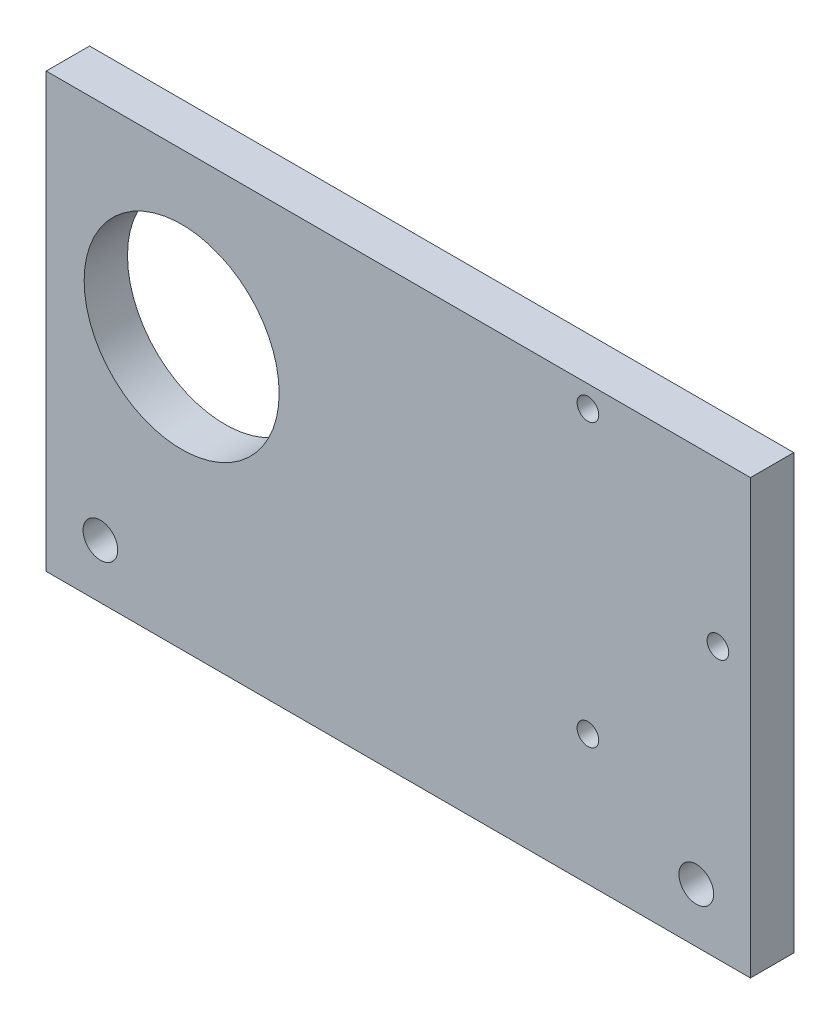
ISO-10303-21;
HEADER;
FILE_DESCRIPTION(('STEP AP214'),'2;1');
FILE_NAME('part.step','',(''),(''),'','','');
FILE_SCHEMA(('AUTOMOTIVE_DESIGN { 1 0 10303 214 1 1 1 1 }'));
ENDSEC;
DATA;
#1=APPLICATION_CONTEXT('core data for automotive mechanical design processes');
#2=APPLICATION_PROTOCOL_DEFINITION('international standard','automotive_design',2000,#1);
#3=PRODUCT_CONTEXT('',#1,'mechanical');
#4=PRODUCT('Part','Part','',(#3));
#5=PRODUCT_RELATED_PRODUCT_CATEGORY('part','',(#4));
#6=PRODUCT_DEFINITION_FORMATION('','',#4);
#7=PRODUCT_DEFINITION_CONTEXT('part definition',#1,'design');
#8=PRODUCT_DEFINITION('design','',#6,#7);
#9=PRODUCT_DEFINITION_SHAPE('','',#8);
#10=(LENGTH_UNIT() NAMED_UNIT(*) SI_UNIT(.MILLI.,.METRE.));
#11=(NAMED_UNIT(*) PLANE_ANGLE_UNIT() SI_UNIT($,.RADIAN.));
#12=(NAMED_UNIT(*) SI_UNIT($,.STERADIAN.) SOLID_ANGLE_UNIT());
#13=UNCERTAINTY_MEASURE_WITH_UNIT(LENGTH_MEASURE(1.E-05),#10,'distance_accuracy_value','');
#14=(GEOMETRIC_REPRESENTATION_CONTEXT(3) GLOBAL_UNCERTAINTY_ASSIGNED_CONTEXT((#13)) GLOBAL_UNIT_ASSIGNED_CONTEXT((#10,
#11,#12)) REPRESENTATION_CONTEXT('',''));
#15=CARTESIAN_POINT('',(0.,0.,0.));
#16=DIRECTION('',(0.,0.,1.));
#17=DIRECTION('',(1.,0.,0.));
#18=AXIS2_PLACEMENT_3D('',#15,#16,#17);
#19=CARTESIAN_POINT('',(0.,0.,4.));
#20=DIRECTION('',(0.,0.,-1.));
#21=DIRECTION('',(-1.,0.,0.));
#22=AXIS2_PLACEMENT_3D('',#19,#20,#21);
#23=PLANE('',#22);
#24=DIRECTION('',(0.,-1.,0.));
#25=VECTOR('',#24,1.);
#26=CARTESIAN_POINT('',(0.,0.,4.));
#27=LINE('',#26,#25);
#28=CARTESIAN_POINT('',(0.,40.,4.));
#29=VERTEX_POINT('',#28);
#30=CARTESIAN_POINT('',(0.,0.,4.));
#31=VERTEX_POINT('',#30);
#32=EDGE_CURVE('E85',#29,#31,#27,.T.);
#33=ORIENTED_EDGE('',*,*,#32,.T.);
#34=DIRECTION('',(1.,0.,0.));
#35=VECTOR('',#34,1.);
#36=CARTESIAN_POINT('',(0.,0.,4.));
#37=LINE('',#36,#35);
#38=CARTESIAN_POINT('',(65.,0.,4.));
#39=VERTEX_POINT('',#38);
#40=EDGE_CURVE('E80',#31,#39,#37,.T.);
#41=ORIENTED_EDGE('',*,*,#40,.T.);
#42=DIRECTION('',(0.,1.,0.));
#43=VECTOR('',#42,1.);
#44=CARTESIAN_POINT('',(65.,0.,4.));
#45=LINE('',#44,#43);
#46=CARTESIAN_POINT('',(65.,40.,4.));
#47=VERTEX_POINT('',#46);
#48=EDGE_CURVE('E83',#39,#47,#45,.T.);
#49=ORIENTED_EDGE('',*,*,#48,.T.);
#50=DIRECTION('',(-1.,0.,0.));
#51=VECTOR('',#50,1.);
#52=CARTESIAN_POINT('',(0.,40.,4.));
#53=LINE('',#52,#51);
#54=EDGE_CURVE('E50',#47,#29,#53,.T.);
#55=ORIENTED_EDGE('',*,*,#54,.T.);
#56=EDGE_LOOP('',(#33,#41,#49,#55));
#57=FACE_BOUND('',#56,.T.);
#58=CARTESIAN_POINT('',(5.,5.,4.));
#59=DIRECTION('',(0.,0.,1.));
#60=DIRECTION('',(1.,0.,0.));
#61=AXIS2_PLACEMENT_3D('',#58,#59,#60);
#62=CIRCLE('',#61,1.6);
#63=CARTESIAN_POINT('',(6.6,5.,4.));
#64=VERTEX_POINT('',#63);
#65=EDGE_CURVE('E100',#64,#64,#62,.T.);
#66=ORIENTED_EDGE('',*,*,#65,.F.);
#67=EDGE_LOOP('',(#66));
#68=FACE_BOUND('',#67,.T.);
#69=CARTESIAN_POINT('',(60.,5.,4.));
#70=DIRECTION('',(0.,0.,1.));
#71=DIRECTION('',(1.,0.,0.));
#72=AXIS2_PLACEMENT_3D('',#69,#70,#71);
#73=CIRCLE('',#72,1.6);
#74=CARTESIAN_POINT('',(61.6,5.,4.));
#75=VERTEX_POINT('',#74);
#76=EDGE_CURVE('E115',#75,#75,#73,.T.);
#77=ORIENTED_EDGE('',*,*,#76,.F.);
#78=EDGE_LOOP('',(#77));
#79=FACE_BOUND('',#78,.T.);
#80=CARTESIAN_POINT('',(50.,12.,4.));
#81=DIRECTION('',(0.,0.,1.));
#82=DIRECTION('',(1.,0.,0.));
#83=AXIS2_PLACEMENT_3D('',#80,#81,#82);
#84=CIRCLE('',#83,0.999999999999998);
#85=CARTESIAN_POINT('',(51.,12.,4.));
#86=VERTEX_POINT('',#85);
#87=EDGE_CURVE('E121',#86,#86,#84,.T.);
#88=ORIENTED_EDGE('',*,*,#87,.F.);
#89=EDGE_LOOP('',(#88));
#90=FACE_BOUND('',#89,.T.);
#91=CARTESIAN_POINT('',(62.,25.,4.));
#92=DIRECTION('',(0.,0.,1.));
#93=DIRECTION('',(1.,0.,0.));
#94=AXIS2_PLACEMENT_3D('',#91,#92,#93);
#95=CIRCLE('',#94,0.999999999999998);
#96=CARTESIAN_POINT('',(63.,25.,4.));
#97=VERTEX_POINT('',#96);
#98=EDGE_CURVE('E127',#97,#97,#95,.T.);
#99=ORIENTED_EDGE('',*,*,#98,.F.);
#100=EDGE_LOOP('',(#99));
#101=FACE_BOUND('',#100,.T.);
#102=CARTESIAN_POINT('',(50.,38.,4.));
#103=DIRECTION('',(0.,0.,1.));
#104=DIRECTION('',(1.,0.,0.));
#105=AXIS2_PLACEMENT_3D('',#102,#103,#104);
#106=CIRCLE('',#105,0.999999999999998);
#107=CARTESIAN_POINT('',(51.,38.,4.));
#108=VERTEX_POINT('',#107);
#109=EDGE_CURVE('E133',#108,#108,#106,.T.);
#110=ORIENTED_EDGE('',*,*,#109,.F.);
#111=EDGE_LOOP('',(#110));
#112=FACE_BOUND('',#111,.T.);
#113=CARTESIAN_POINT('',(12.5,25.,4.));
#114=DIRECTION('',(0.,0.,1.));
#115=DIRECTION('',(1.,0.,0.));
#116=AXIS2_PLACEMENT_3D('',#113,#114,#115);
#117=CIRCLE('',#116,9.);
#118=CARTESIAN_POINT('',(21.5,25.,4.));
#119=VERTEX_POINT('',#118);
#120=EDGE_CURVE('E139',#119,#119,#117,.T.);
#121=ORIENTED_EDGE('',*,*,#120,.F.);
#122=EDGE_LOOP('',(#121));
#123=FACE_BOUND('',#122,.T.);
#124=ADVANCED_FACE('F33',(#57,#68,#79,#90,#101,#112,#123),#23,.F.);
#125=CARTESIAN_POINT('',(0.,0.,0.));
#126=DIRECTION('',(0.,0.,-1.));
#127=DIRECTION('',(-1.,0.,0.));
#128=AXIS2_PLACEMENT_3D('',#125,#126,#127);
#129=PLANE('',#128);
#130=CARTESIAN_POINT('',(50.,38.,0.));
#131=DIRECTION('',(0.,0.,1.));
#132=DIRECTION('',(1.,0.,0.));
#133=AXIS2_PLACEMENT_3D('',#130,#131,#132);
#134=CIRCLE('',#133,0.999999999999998);
#135=CARTESIAN_POINT('',(51.,38.,0.));
#136=VERTEX_POINT('',#135);
#137=EDGE_CURVE('E136',#136,#136,#134,.T.);
#138=ORIENTED_EDGE('',*,*,#137,.T.);
#139=EDGE_LOOP('',(#138));
#140=FACE_BOUND('',#139,.T.);
#141=CARTESIAN_POINT('',(50.,12.,0.));
#142=DIRECTION('',(0.,0.,1.));
#143=DIRECTION('',(1.,0.,0.));
#144=AXIS2_PLACEMENT_3D('',#141,#142,#143);
#145=CIRCLE('',#144,0.999999999999998);
#146=CARTESIAN_POINT('',(51.,12.,0.));
#147=VERTEX_POINT('',#146);
#148=EDGE_CURVE('E124',#147,#147,#145,.T.);
#149=ORIENTED_EDGE('',*,*,#148,.T.);
#150=EDGE_LOOP('',(#149));
#151=FACE_BOUND('',#150,.T.);
#152=CARTESIAN_POINT('',(5.,5.,0.));
#153=DIRECTION('',(0.,0.,1.));
#154=DIRECTION('',(1.,0.,0.));
#155=AXIS2_PLACEMENT_3D('',#152,#153,#154);
#156=CIRCLE('',#155,1.6);
#157=CARTESIAN_POINT('',(6.6,5.,0.));
#158=VERTEX_POINT('',#157);
#159=EDGE_CURVE('E112',#158,#158,#156,.T.);
#160=ORIENTED_EDGE('',*,*,#159,.T.);
#161=EDGE_LOOP('',(#160));
#162=FACE_BOUND('',#161,.T.);
#163=DIRECTION('',(0.,-1.,0.));
#164=VECTOR('',#163,1.);
#165=CARTESIAN_POINT('',(0.,0.,0.));
#166=LINE('',#165,#164);
#167=CARTESIAN_POINT('',(0.,40.,0.));
#168=VERTEX_POINT('',#167);
#169=CARTESIAN_POINT('',(0.,0.,0.));
#170=VERTEX_POINT('',#169);
#171=EDGE_CURVE('E97',#168,#170,#166,.T.);
#172=ORIENTED_EDGE('',*,*,#171,.F.);
#173=DIRECTION('',(-1.,0.,0.));
#174=VECTOR('',#173,1.);
#175=CARTESIAN_POINT('',(0.,40.,0.));
#176=LINE('',#175,#174);
#177=CARTESIAN_POINT('',(65.,40.,0.));
#178=VERTEX_POINT('',#177);
#179=EDGE_CURVE('E73',#178,#168,#176,.T.);
#180=ORIENTED_EDGE('',*,*,#179,.F.);
#181=DIRECTION('',(0.,1.,0.));
#182=VECTOR('',#181,1.);
#183=CARTESIAN_POINT('',(65.,0.,0.));
#184=LINE('',#183,#182);
#185=CARTESIAN_POINT('',(65.,0.,0.));
#186=VERTEX_POINT('',#185);
#187=EDGE_CURVE('E67',#186,#178,#184,.T.);
#188=ORIENTED_EDGE('',*,*,#187,.F.);
#189=DIRECTION('',(1.,0.,0.));
#190=VECTOR('',#189,1.);
#191=CARTESIAN_POINT('',(0.,0.,0.));
#192=LINE('',#191,#190);
#193=EDGE_CURVE('E89',#170,#186,#192,.T.);
#194=ORIENTED_EDGE('',*,*,#193,.F.);
#195=EDGE_LOOP('',(#172,#180,#188,#194));
#196=FACE_BOUND('',#195,.T.);
#197=CARTESIAN_POINT('',(60.,5.,0.));
#198=DIRECTION('',(0.,0.,1.));
#199=DIRECTION('',(1.,0.,0.));
#200=AXIS2_PLACEMENT_3D('',#197,#198,#199);
#201=CIRCLE('',#200,1.6);
#202=CARTESIAN_POINT('',(61.6,5.,0.));
#203=VERTEX_POINT('',#202);
#204=EDGE_CURVE('E118',#203,#203,#201,.T.);
#205=ORIENTED_EDGE('',*,*,#204,.T.);
#206=EDGE_LOOP('',(#205));
#207=FACE_BOUND('',#206,.T.);
#208=CARTESIAN_POINT('',(62.,25.,0.));
#209=DIRECTION('',(0.,0.,1.));
#210=DIRECTION('',(1.,0.,0.));
#211=AXIS2_PLACEMENT_3D('',#208,#209,#210);
#212=CIRCLE('',#211,0.999999999999998);
#213=CARTESIAN_POINT('',(63.,25.,0.));
#214=VERTEX_POINT('',#213);
#215=EDGE_CURVE('E130',#214,#214,#212,.T.);
#216=ORIENTED_EDGE('',*,*,#215,.T.);
#217=EDGE_LOOP('',(#216));
#218=FACE_BOUND('',#217,.T.);
#219=CARTESIAN_POINT('',(12.5,25.,0.));
#220=DIRECTION('',(0.,0.,1.));
#221=DIRECTION('',(1.,0.,0.));
#222=AXIS2_PLACEMENT_3D('',#219,#220,#221);
#223=CIRCLE('',#222,9.);
#224=CARTESIAN_POINT('',(21.5,25.,0.));
#225=VERTEX_POINT('',#224);
#226=EDGE_CURVE('E142',#225,#225,#223,.T.);
#227=ORIENTED_EDGE('',*,*,#226,.T.);
#228=EDGE_LOOP('',(#227));
#229=FACE_BOUND('',#228,.T.);
#230=ADVANCED_FACE('F108',(#140,#151,#162,#196,#207,#218,#229),#129,.T.);
#231=CARTESIAN_POINT('',(0.,0.,4.));
#232=DIRECTION('',(1.,0.,0.));
#233=DIRECTION('',(0.,0.,-1.));
#234=AXIS2_PLACEMENT_3D('',#231,#232,#233);
#235=PLANE('',#234);
#236=ORIENTED_EDGE('',*,*,#171,.T.);
#237=DIRECTION('',(0.,0.,-1.));
#238=VECTOR('',#237,1.);
#239=CARTESIAN_POINT('',(0.,0.,4.));
#240=LINE('',#239,#238);
#241=EDGE_CURVE('E11',#31,#170,#240,.T.);
#242=ORIENTED_EDGE('',*,*,#241,.F.);
#243=ORIENTED_EDGE('',*,*,#32,.F.);
#244=DIRECTION('',(0.,0.,-1.));
#245=VECTOR('',#244,1.);
#246=CARTESIAN_POINT('',(0.,40.,4.));
#247=LINE('',#246,#245);
#248=EDGE_CURVE('E93',#29,#168,#247,.T.);
#249=ORIENTED_EDGE('',*,*,#248,.T.);
#250=EDGE_LOOP('',(#236,#242,#243,#249));
#251=FACE_BOUND('',#250,.T.);
#252=ADVANCED_FACE('F35',(#251),#235,.F.);
#253=CARTESIAN_POINT('',(0.,0.,4.));
#254=DIRECTION('',(0.,1.,0.));
#255=DIRECTION('',(0.,0.,1.));
#256=AXIS2_PLACEMENT_3D('',#253,#254,#255);
#257=PLANE('',#256);
#258=ORIENTED_EDGE('',*,*,#193,.T.);
#259=DIRECTION('',(0.,0.,-1.));
#260=VECTOR('',#259,1.);
#261=CARTESIAN_POINT('',(65.,0.,4.));
#262=LINE('',#261,#260);
#263=EDGE_CURVE('E42',#39,#186,#262,.T.);
#264=ORIENTED_EDGE('',*,*,#263,.F.);
#265=ORIENTED_EDGE('',*,*,#40,.F.);
#266=ORIENTED_EDGE('',*,*,#241,.T.);
#267=EDGE_LOOP('',(#258,#264,#265,#266));
#268=FACE_BOUND('',#267,.T.);
#269=ADVANCED_FACE('F88',(#268),#257,.F.);
#270=CARTESIAN_POINT('',(65.,0.,4.));
#271=DIRECTION('',(-1.,0.,0.));
#272=DIRECTION('',(0.,0.,1.));
#273=AXIS2_PLACEMENT_3D('',#270,#271,#272);
#274=PLANE('',#273);
#275=ORIENTED_EDGE('',*,*,#187,.T.);
#276=DIRECTION('',(0.,0.,-1.));
#277=VECTOR('',#276,1.);
#278=CARTESIAN_POINT('',(65.,40.,4.));
#279=LINE('',#278,#277);
#280=EDGE_CURVE('E90',#47,#178,#279,.T.);
#281=ORIENTED_EDGE('',*,*,#280,.F.);
#282=ORIENTED_EDGE('',*,*,#48,.F.);
#283=ORIENTED_EDGE('',*,*,#263,.T.);
#284=EDGE_LOOP('',(#275,#281,#282,#283));
#285=FACE_BOUND('',#284,.T.);
#286=ADVANCED_FACE('F91',(#285),#274,.F.);
#287=CARTESIAN_POINT('',(0.,40.,4.));
#288=DIRECTION('',(0.,-1.,0.));
#289=DIRECTION('',(0.,0.,-1.));
#290=AXIS2_PLACEMENT_3D('',#287,#288,#289);
#291=PLANE('',#290);
#292=ORIENTED_EDGE('',*,*,#179,.T.);
#293=ORIENTED_EDGE('',*,*,#248,.F.);
#294=ORIENTED_EDGE('',*,*,#54,.F.);
#295=ORIENTED_EDGE('',*,*,#280,.T.);
#296=EDGE_LOOP('',(#292,#293,#294,#295));
#297=FACE_BOUND('',#296,.T.);
#298=ADVANCED_FACE('F105',(#297),#291,.F.);
#299=CARTESIAN_POINT('',(5.,5.,4.));
#300=DIRECTION('',(0.,0.,-1.));
#301=DIRECTION('',(-1.,0.,0.));
#302=AXIS2_PLACEMENT_3D('',#299,#300,#301);
#303=CYLINDRICAL_SURFACE('',#302,1.6);
#304=ORIENTED_EDGE('',*,*,#65,.T.);
#305=EDGE_LOOP('',(#304));
#306=FACE_BOUND('',#305,.T.);
#307=ORIENTED_EDGE('',*,*,#159,.F.);
#308=EDGE_LOOP('',(#307));
#309=FACE_BOUND('',#308,.T.);
#310=ADVANCED_FACE('F159',(#306,#309),#303,.F.);
#311=CARTESIAN_POINT('',(60.,5.,4.));
#312=DIRECTION('',(0.,0.,-1.));
#313=DIRECTION('',(-1.,0.,0.));
#314=AXIS2_PLACEMENT_3D('',#311,#312,#313);
#315=CYLINDRICAL_SURFACE('',#314,1.6);
#316=ORIENTED_EDGE('',*,*,#76,.T.);
#317=EDGE_LOOP('',(#316));
#318=FACE_BOUND('',#317,.T.);
#319=ORIENTED_EDGE('',*,*,#204,.F.);
#320=EDGE_LOOP('',(#319));
#321=FACE_BOUND('',#320,.T.);
#322=ADVANCED_FACE('F205',(#318,#321),#315,.F.);
#323=CARTESIAN_POINT('',(50.,12.,4.));
#324=DIRECTION('',(0.,0.,-1.));
#325=DIRECTION('',(-1.,0.,0.));
#326=AXIS2_PLACEMENT_3D('',#323,#324,#325);
#327=CYLINDRICAL_SURFACE('',#326,0.999999999999998);
#328=ORIENTED_EDGE('',*,*,#87,.T.);
#329=EDGE_LOOP('',(#328));
#330=FACE_BOUND('',#329,.T.);
#331=ORIENTED_EDGE('',*,*,#148,.F.);
#332=EDGE_LOOP('',(#331));
#333=FACE_BOUND('',#332,.T.);
#334=ADVANCED_FACE('F213',(#330,#333),#327,.F.);
#335=CARTESIAN_POINT('',(62.,25.,4.));
#336=DIRECTION('',(0.,0.,-1.));
#337=DIRECTION('',(-1.,0.,0.));
#338=AXIS2_PLACEMENT_3D('',#335,#336,#337);
#339=CYLINDRICAL_SURFACE('',#338,0.999999999999998);
#340=ORIENTED_EDGE('',*,*,#98,.T.);
#341=EDGE_LOOP('',(#340));
#342=FACE_BOUND('',#341,.T.);
#343=ORIENTED_EDGE('',*,*,#215,.F.);
#344=EDGE_LOOP('',(#343));
#345=FACE_BOUND('',#344,.T.);
#346=ADVANCED_FACE('F221',(#342,#345),#339,.F.);
#347=CARTESIAN_POINT('',(50.,38.,4.));
#348=DIRECTION('',(0.,0.,-1.));
#349=DIRECTION('',(-1.,0.,0.));
#350=AXIS2_PLACEMENT_3D('',#347,#348,#349);
#351=CYLINDRICAL_SURFACE('',#350,0.999999999999998);
#352=ORIENTED_EDGE('',*,*,#109,.T.);
#353=EDGE_LOOP('',(#352));
#354=FACE_BOUND('',#353,.T.);
#355=ORIENTED_EDGE('',*,*,#137,.F.);
#356=EDGE_LOOP('',(#355));
#357=FACE_BOUND('',#356,.T.);
#358=ADVANCED_FACE('F230',(#354,#357),#351,.F.);
#359=CARTESIAN_POINT('',(12.5,25.,4.));
#360=DIRECTION('',(0.,0.,-1.));
#361=DIRECTION('',(-1.,0.,0.));
#362=AXIS2_PLACEMENT_3D('',#359,#360,#361);
#363=CYLINDRICAL_SURFACE('',#362,9.);
#364=ORIENTED_EDGE('',*,*,#120,.T.);
#365=EDGE_LOOP('',(#364));
#366=FACE_BOUND('',#365,.T.);
#367=ORIENTED_EDGE('',*,*,#226,.F.);
#368=EDGE_LOOP('',(#367));
#369=FACE_BOUND('',#368,.T.);
#370=ADVANCED_FACE('F148',(#366,#369),#363,.F.);
#371=CLOSED_SHELL('',(#124,#230,#252,#269,#286,#298,#310,#322,#334,#346,#358,#370));
#372=MANIFOLD_SOLID_BREP('B2',#371);
#373=ADVANCED_BREP_SHAPE_REPRESENTATION('',(#18,#372),#14);
#374=SHAPE_DEFINITION_REPRESENTATION(#9,#373);
ENDSEC;
END-ISO-10303-21;
